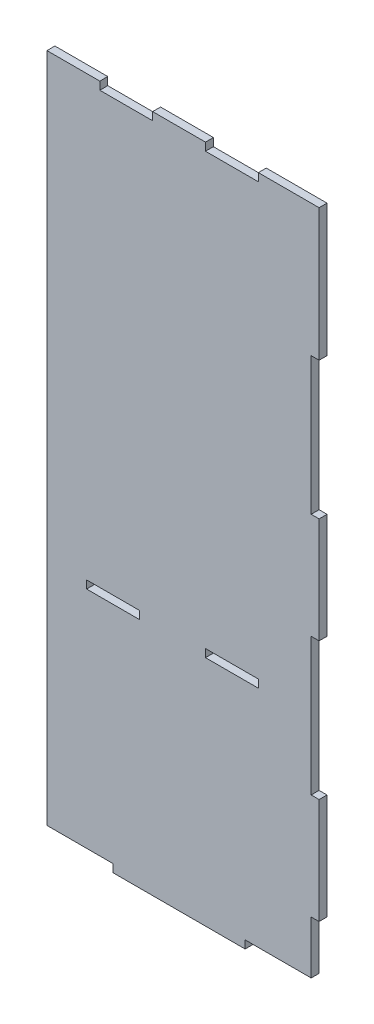
ISO-10303-21;
HEADER;
FILE_DESCRIPTION(('STEP AP214'),'2;1');
FILE_NAME('part.step','',(''),(''),'','','');
FILE_SCHEMA(('AUTOMOTIVE_DESIGN { 1 0 10303 214 1 1 1 1 }'));
ENDSEC;
DATA;
#1=APPLICATION_CONTEXT('core data for automotive mechanical design processes');
#2=APPLICATION_PROTOCOL_DEFINITION('international standard','automotive_design',2000,#1);
#3=PRODUCT_CONTEXT('',#1,'mechanical');
#4=PRODUCT('Part','Part','',(#3));
#5=PRODUCT_RELATED_PRODUCT_CATEGORY('part','',(#4));
#6=PRODUCT_DEFINITION_FORMATION('','',#4);
#7=PRODUCT_DEFINITION_CONTEXT('part definition',#1,'design');
#8=PRODUCT_DEFINITION('design','',#6,#7);
#9=PRODUCT_DEFINITION_SHAPE('','',#8);
#10=(LENGTH_UNIT() NAMED_UNIT(*) SI_UNIT(.MILLI.,.METRE.));
#11=(NAMED_UNIT(*) PLANE_ANGLE_UNIT() SI_UNIT($,.RADIAN.));
#12=(NAMED_UNIT(*) SI_UNIT($,.STERADIAN.) SOLID_ANGLE_UNIT());
#13=UNCERTAINTY_MEASURE_WITH_UNIT(LENGTH_MEASURE(1.E-05),#10,'distance_accuracy_value','');
#14=(GEOMETRIC_REPRESENTATION_CONTEXT(3) GLOBAL_UNCERTAINTY_ASSIGNED_CONTEXT((#13)) GLOBAL_UNIT_ASSIGNED_CONTEXT((#10,
#11,#12)) REPRESENTATION_CONTEXT('',''));
#15=CARTESIAN_POINT('',(0.,0.,0.));
#16=DIRECTION('',(0.,0.,1.));
#17=DIRECTION('',(1.,0.,0.));
#18=AXIS2_PLACEMENT_3D('',#15,#16,#17);
#19=CARTESIAN_POINT('',(40.7478559176672,98.6809605488851,3.));
#20=DIRECTION('',(-1.,0.,0.));
#21=DIRECTION('',(0.,-1.,0.));
#22=AXIS2_PLACEMENT_3D('',#19,#20,#21);
#23=PLANE('',#22);
#24=DIRECTION('',(0.,0.,1.));
#25=VECTOR('',#24,1.);
#26=CARTESIAN_POINT('',(40.7478559176672,-95.3190394511175,0.));
#27=LINE('',#26,#25);
#28=CARTESIAN_POINT('',(40.7478559176672,-95.3190394511175,0.));
#29=VERTEX_POINT('',#28);
#30=CARTESIAN_POINT('',(40.7478559176672,-95.3190394511175,3.));
#31=VERTEX_POINT('',#30);
#32=EDGE_CURVE('E338',#29,#31,#27,.T.);
#33=ORIENTED_EDGE('',*,*,#32,.F.);
#34=DIRECTION('',(0.,1.,0.));
#35=VECTOR('',#34,1.);
#36=CARTESIAN_POINT('',(40.7478559176672,98.6809605488851,0.));
#37=LINE('',#36,#35);
#38=CARTESIAN_POINT('',(40.7478559176672,-43.3190394511175,0.));
#39=VERTEX_POINT('',#38);
#40=EDGE_CURVE('E507',#29,#39,#37,.T.);
#41=ORIENTED_EDGE('',*,*,#40,.T.);
#42=DIRECTION('',(0.,0.,-1.));
#43=VECTOR('',#42,1.);
#44=CARTESIAN_POINT('',(40.7478559176672,-43.3190394511175,3.));
#45=LINE('',#44,#43);
#46=CARTESIAN_POINT('',(40.7478559176672,-43.3190394511175,3.));
#47=VERTEX_POINT('',#46);
#48=EDGE_CURVE('E368',#47,#39,#45,.T.);
#49=ORIENTED_EDGE('',*,*,#48,.F.);
#50=DIRECTION('',(0.,1.,0.));
#51=VECTOR('',#50,1.);
#52=CARTESIAN_POINT('',(40.7478559176672,98.6809605488851,3.));
#53=LINE('',#52,#51);
#54=EDGE_CURVE('E492',#31,#47,#53,.T.);
#55=ORIENTED_EDGE('',*,*,#54,.F.);
#56=EDGE_LOOP('',(#33,#41,#49,#55));
#57=FACE_BOUND('',#56,.T.);
#58=ADVANCED_FACE('F34',(#57),#23,.F.);
#59=CARTESIAN_POINT('',(40.7478559176672,-155.319039451115,0.));
#60=VERTEX_POINT('',#59);
#61=CARTESIAN_POINT('',(40.7478559176672,-135.319039451117,0.));
#62=VERTEX_POINT('',#61);
#63=EDGE_CURVE('E504',#60,#62,#37,.T.);
#64=ORIENTED_EDGE('',*,*,#63,.T.);
#65=DIRECTION('',(0.,0.,1.));
#66=VECTOR('',#65,1.);
#67=CARTESIAN_POINT('',(40.7478559176672,-135.319039451117,0.));
#68=LINE('',#67,#66);
#69=CARTESIAN_POINT('',(40.7478559176672,-135.319039451117,3.));
#70=VERTEX_POINT('',#69);
#71=EDGE_CURVE('E341',#62,#70,#68,.T.);
#72=ORIENTED_EDGE('',*,*,#71,.T.);
#73=CARTESIAN_POINT('',(40.7478559176672,-155.319039451115,3.));
#74=VERTEX_POINT('',#73);
#75=EDGE_CURVE('E488',#74,#70,#53,.T.);
#76=ORIENTED_EDGE('',*,*,#75,.F.);
#77=DIRECTION('',(0.,0.,-1.));
#78=VECTOR('',#77,1.);
#79=CARTESIAN_POINT('',(40.7478559176672,-155.319039451115,3.));
#80=LINE('',#79,#78);
#81=EDGE_CURVE('E42',#74,#60,#80,.T.);
#82=ORIENTED_EDGE('',*,*,#81,.T.);
#83=EDGE_LOOP('',(#64,#72,#76,#82));
#84=FACE_BOUND('',#83,.T.);
#85=ADVANCED_FACE('F517',(#84),#23,.F.);
#86=CARTESIAN_POINT('',(-59.2521440823328,98.6809605488851,3.));
#87=DIRECTION('',(0.,-1.,0.));
#88=DIRECTION('',(0.,0.,-1.));
#89=AXIS2_PLACEMENT_3D('',#86,#87,#88);
#90=PLANE('',#89);
#91=DIRECTION('',(-1.,0.,0.));
#92=VECTOR('',#91,1.);
#93=CARTESIAN_POINT('',(-59.2521440823328,98.6809605488851,0.));
#94=LINE('',#93,#92);
#95=CARTESIAN_POINT('',(0.747855917667215,98.6809605488851,0.));
#96=VERTEX_POINT('',#95);
#97=CARTESIAN_POINT('',(-19.2521440823328,98.6809605488851,0.));
#98=VERTEX_POINT('',#97);
#99=EDGE_CURVE('E510',#96,#98,#94,.T.);
#100=ORIENTED_EDGE('',*,*,#99,.T.);
#101=DIRECTION('',(0.,0.,-1.));
#102=VECTOR('',#101,1.);
#103=CARTESIAN_POINT('',(-19.2521440823328,98.6809605488851,0.));
#104=LINE('',#103,#102);
#105=CARTESIAN_POINT('',(-19.2521440823328,98.6809605488851,3.));
#106=VERTEX_POINT('',#105);
#107=EDGE_CURVE('E415',#106,#98,#104,.T.);
#108=ORIENTED_EDGE('',*,*,#107,.F.);
#109=DIRECTION('',(-1.,0.,0.));
#110=VECTOR('',#109,1.);
#111=CARTESIAN_POINT('',(-59.2521440823328,98.6809605488851,3.));
#112=LINE('',#111,#110);
#113=CARTESIAN_POINT('',(0.747855917667215,98.6809605488851,3.));
#114=VERTEX_POINT('',#113);
#115=EDGE_CURVE('E497',#114,#106,#112,.T.);
#116=ORIENTED_EDGE('',*,*,#115,.F.);
#117=DIRECTION('',(0.,0.,1.));
#118=VECTOR('',#117,1.);
#119=CARTESIAN_POINT('',(0.747855917667215,98.6809605488851,0.));
#120=LINE('',#119,#118);
#121=EDGE_CURVE('E401',#96,#114,#120,.T.);
#122=ORIENTED_EDGE('',*,*,#121,.F.);
#123=EDGE_LOOP('',(#100,#108,#116,#122));
#124=FACE_BOUND('',#123,.T.);
#125=ADVANCED_FACE('F563',(#124),#90,.F.);
#126=CARTESIAN_POINT('',(-39.2521440823328,98.6809605488851,3.));
#127=VERTEX_POINT('',#126);
#128=CARTESIAN_POINT('',(-59.2521440823328,98.6809605488851,3.));
#129=VERTEX_POINT('',#128);
#130=EDGE_CURVE('E491',#127,#129,#112,.T.);
#131=ORIENTED_EDGE('',*,*,#130,.F.);
#132=DIRECTION('',(0.,0.,1.));
#133=VECTOR('',#132,1.);
#134=CARTESIAN_POINT('',(-39.2521440823328,98.6809605488851,0.));
#135=LINE('',#134,#133);
#136=CARTESIAN_POINT('',(-39.2521440823328,98.6809605488851,0.));
#137=VERTEX_POINT('',#136);
#138=EDGE_CURVE('E405',#137,#127,#135,.T.);
#139=ORIENTED_EDGE('',*,*,#138,.F.);
#140=CARTESIAN_POINT('',(-59.2521440823328,98.6809605488851,0.));
#141=VERTEX_POINT('',#140);
#142=EDGE_CURVE('E506',#137,#141,#94,.T.);
#143=ORIENTED_EDGE('',*,*,#142,.T.);
#144=DIRECTION('',(0.,0.,-1.));
#145=VECTOR('',#144,1.);
#146=CARTESIAN_POINT('',(-59.2521440823328,98.6809605488851,3.));
#147=LINE('',#146,#145);
#148=EDGE_CURVE('E496',#129,#141,#147,.T.);
#149=ORIENTED_EDGE('',*,*,#148,.F.);
#150=EDGE_LOOP('',(#131,#139,#143,#149));
#151=FACE_BOUND('',#150,.T.);
#152=ADVANCED_FACE('F632',(#151),#90,.F.);
#153=CARTESIAN_POINT('',(-59.2521440823328,-155.319039451115,3.));
#154=DIRECTION('',(0.,1.,0.));
#155=DIRECTION('',(0.,0.,1.));
#156=AXIS2_PLACEMENT_3D('',#153,#154,#155);
#157=PLANE('',#156);
#158=DIRECTION('',(0.,0.,-1.));
#159=VECTOR('',#158,1.);
#160=CARTESIAN_POINT('',(-34.2521440823328,-155.319039451115,3.));
#161=LINE('',#160,#159);
#162=CARTESIAN_POINT('',(-34.2521440823328,-155.319039451115,3.));
#163=VERTEX_POINT('',#162);
#164=CARTESIAN_POINT('',(-34.2521440823328,-155.319039451115,0.));
#165=VERTEX_POINT('',#164);
#166=EDGE_CURVE('E421',#163,#165,#161,.T.);
#167=ORIENTED_EDGE('',*,*,#166,.F.);
#168=DIRECTION('',(1.,0.,0.));
#169=VECTOR('',#168,1.);
#170=CARTESIAN_POINT('',(-59.2521440823328,-155.319039451115,3.));
#171=LINE('',#170,#169);
#172=CARTESIAN_POINT('',(-59.2521440823328,-155.319039451115,3.));
#173=VERTEX_POINT('',#172);
#174=EDGE_CURVE('E484',#173,#163,#171,.T.);
#175=ORIENTED_EDGE('',*,*,#174,.F.);
#176=DIRECTION('',(0.,0.,-1.));
#177=VECTOR('',#176,1.);
#178=CARTESIAN_POINT('',(-59.2521440823328,-155.319039451115,3.));
#179=LINE('',#178,#177);
#180=CARTESIAN_POINT('',(-59.2521440823328,-155.319039451115,0.));
#181=VERTEX_POINT('',#180);
#182=EDGE_CURVE('E11',#173,#181,#179,.T.);
#183=ORIENTED_EDGE('',*,*,#182,.T.);
#184=DIRECTION('',(1.,0.,0.));
#185=VECTOR('',#184,1.);
#186=CARTESIAN_POINT('',(-59.2521440823328,-155.319039451115,0.));
#187=LINE('',#186,#185);
#188=EDGE_CURVE('E501',#181,#165,#187,.T.);
#189=ORIENTED_EDGE('',*,*,#188,.T.);
#190=EDGE_LOOP('',(#167,#175,#183,#189));
#191=FACE_BOUND('',#190,.T.);
#192=ADVANCED_FACE('F547',(#191),#157,.F.);
#193=DIRECTION('',(0.,0.,1.));
#194=VECTOR('',#193,1.);
#195=CARTESIAN_POINT('',(15.7478559176672,-155.319039451115,3.));
#196=LINE('',#195,#194);
#197=CARTESIAN_POINT('',(15.7478559176672,-155.319039451115,0.));
#198=VERTEX_POINT('',#197);
#199=CARTESIAN_POINT('',(15.7478559176672,-155.319039451115,3.));
#200=VERTEX_POINT('',#199);
#201=EDGE_CURVE('E456',#198,#200,#196,.T.);
#202=ORIENTED_EDGE('',*,*,#201,.F.);
#203=EDGE_CURVE('E500',#198,#60,#187,.T.);
#204=ORIENTED_EDGE('',*,*,#203,.T.);
#205=ORIENTED_EDGE('',*,*,#81,.F.);
#206=EDGE_CURVE('E482',#200,#74,#171,.T.);
#207=ORIENTED_EDGE('',*,*,#206,.F.);
#208=EDGE_LOOP('',(#202,#204,#205,#207));
#209=FACE_BOUND('',#208,.T.);
#210=ADVANCED_FACE('F535',(#209),#157,.F.);
#211=CARTESIAN_POINT('',(-59.2521440823328,98.6809605488851,3.));
#212=DIRECTION('',(1.,0.,0.));
#213=DIRECTION('',(0.,1.,0.));
#214=AXIS2_PLACEMENT_3D('',#211,#212,#213);
#215=PLANE('',#214);
#216=DIRECTION('',(0.,-1.,0.));
#217=VECTOR('',#216,1.);
#218=CARTESIAN_POINT('',(-59.2521440823328,98.6809605488851,0.));
#219=LINE('',#218,#217);
#220=EDGE_CURVE('E478',#141,#181,#219,.T.);
#221=ORIENTED_EDGE('',*,*,#220,.T.);
#222=ORIENTED_EDGE('',*,*,#182,.F.);
#223=DIRECTION('',(0.,-1.,0.));
#224=VECTOR('',#223,1.);
#225=CARTESIAN_POINT('',(-59.2521440823328,98.6809605488851,3.));
#226=LINE('',#225,#224);
#227=EDGE_CURVE('E479',#129,#173,#226,.T.);
#228=ORIENTED_EDGE('',*,*,#227,.F.);
#229=ORIENTED_EDGE('',*,*,#148,.T.);
#230=EDGE_LOOP('',(#221,#222,#228,#229));
#231=FACE_BOUND('',#230,.T.);
#232=ADVANCED_FACE('F36',(#231),#215,.F.);
#233=CARTESIAN_POINT('',(40.7478559176672,-3.31903945111747,3.));
#234=VERTEX_POINT('',#233);
#235=CARTESIAN_POINT('',(40.7478559176672,48.6809605488851,3.));
#236=VERTEX_POINT('',#235);
#237=EDGE_CURVE('E487',#234,#236,#53,.T.);
#238=ORIENTED_EDGE('',*,*,#237,.F.);
#239=DIRECTION('',(0.,0.,-1.));
#240=VECTOR('',#239,1.);
#241=CARTESIAN_POINT('',(40.7478559176672,-3.31903945111747,3.));
#242=LINE('',#241,#240);
#243=CARTESIAN_POINT('',(40.7478559176672,-3.31903945111747,0.));
#244=VERTEX_POINT('',#243);
#245=EDGE_CURVE('E365',#234,#244,#242,.T.);
#246=ORIENTED_EDGE('',*,*,#245,.T.);
#247=CARTESIAN_POINT('',(40.7478559176672,48.6809605488851,0.));
#248=VERTEX_POINT('',#247);
#249=EDGE_CURVE('E503',#244,#248,#37,.T.);
#250=ORIENTED_EDGE('',*,*,#249,.T.);
#251=DIRECTION('',(0.,0.,1.));
#252=VECTOR('',#251,1.);
#253=CARTESIAN_POINT('',(40.7478559176672,48.6809605488851,0.));
#254=LINE('',#253,#252);
#255=EDGE_CURVE('E372',#248,#236,#254,.T.);
#256=ORIENTED_EDGE('',*,*,#255,.T.);
#257=EDGE_LOOP('',(#238,#246,#250,#256));
#258=FACE_BOUND('',#257,.T.);
#259=ADVANCED_FACE('F595',(#258),#23,.F.);
#260=CARTESIAN_POINT('',(43.7478559176672,98.6809605488851,0.));
#261=VERTEX_POINT('',#260);
#262=CARTESIAN_POINT('',(20.7478559176672,98.6809605488851,0.));
#263=VERTEX_POINT('',#262);
#264=EDGE_CURVE('E483',#261,#263,#94,.T.);
#265=ORIENTED_EDGE('',*,*,#264,.T.);
#266=DIRECTION('',(0.,0.,-1.));
#267=VECTOR('',#266,1.);
#268=CARTESIAN_POINT('',(20.7478559176672,98.6809605488851,0.));
#269=LINE('',#268,#267);
#270=CARTESIAN_POINT('',(20.7478559176672,98.6809605488851,3.));
#271=VERTEX_POINT('',#270);
#272=EDGE_CURVE('E433',#271,#263,#269,.T.);
#273=ORIENTED_EDGE('',*,*,#272,.F.);
#274=CARTESIAN_POINT('',(43.7478559176672,98.6809605488851,3.));
#275=VERTEX_POINT('',#274);
#276=EDGE_CURVE('E493',#275,#271,#112,.T.);
#277=ORIENTED_EDGE('',*,*,#276,.F.);
#278=DIRECTION('',(0.,0.,1.));
#279=VECTOR('',#278,1.);
#280=CARTESIAN_POINT('',(43.7478559176672,98.6809605488851,0.));
#281=LINE('',#280,#279);
#282=EDGE_CURVE('E382',#261,#275,#281,.T.);
#283=ORIENTED_EDGE('',*,*,#282,.F.);
#284=EDGE_LOOP('',(#265,#273,#277,#283));
#285=FACE_BOUND('',#284,.T.);
#286=ADVANCED_FACE('F583',(#285),#90,.F.);
#287=CARTESIAN_POINT('',(0.,0.,3.));
#288=DIRECTION('',(0.,0.,1.));
#289=DIRECTION('',(1.,0.,0.));
#290=AXIS2_PLACEMENT_3D('',#287,#288,#289);
#291=PLANE('',#290);
#292=DIRECTION('',(0.,-1.,0.));
#293=VECTOR('',#292,1.);
#294=CARTESIAN_POINT('',(20.7478559176646,-67.3190394511058,3.));
#295=LINE('',#294,#293);
#296=CARTESIAN_POINT('',(20.7478559176646,-67.3190394511058,3.));
#297=VERTEX_POINT('',#296);
#298=CARTESIAN_POINT('',(20.7478559176646,-70.3190394511058,3.));
#299=VERTEX_POINT('',#298);
#300=EDGE_CURVE('E259',#297,#299,#295,.T.);
#301=ORIENTED_EDGE('',*,*,#300,.T.);
#302=DIRECTION('',(-1.,0.,0.));
#303=VECTOR('',#302,1.);
#304=CARTESIAN_POINT('',(20.7478559176646,-70.3190394511058,3.));
#305=LINE('',#304,#303);
#306=CARTESIAN_POINT('',(0.747855917664561,-70.3190394511058,3.));
#307=VERTEX_POINT('',#306);
#308=EDGE_CURVE('E270',#299,#307,#305,.T.);
#309=ORIENTED_EDGE('',*,*,#308,.T.);
#310=DIRECTION('',(0.,1.,0.));
#311=VECTOR('',#310,1.);
#312=CARTESIAN_POINT('',(0.747855917664561,-67.3190394511058,3.));
#313=LINE('',#312,#311);
#314=CARTESIAN_POINT('',(0.747855917664561,-67.3190394511058,3.));
#315=VERTEX_POINT('',#314);
#316=EDGE_CURVE('E49',#307,#315,#313,.T.);
#317=ORIENTED_EDGE('',*,*,#316,.T.);
#318=DIRECTION('',(1.,0.,0.));
#319=VECTOR('',#318,1.);
#320=CARTESIAN_POINT('',(20.7478559176646,-67.3190394511058,3.));
#321=LINE('',#320,#319);
#322=EDGE_CURVE('E267',#315,#297,#321,.T.);
#323=ORIENTED_EDGE('',*,*,#322,.T.);
#324=EDGE_LOOP('',(#301,#309,#317,#323));
#325=FACE_BOUND('',#324,.T.);
#326=DIRECTION('',(0.,-1.,0.));
#327=VECTOR('',#326,1.);
#328=CARTESIAN_POINT('',(-24.2521440823354,-67.3190394511058,3.));
#329=LINE('',#328,#327);
#330=CARTESIAN_POINT('',(-24.2521440823354,-67.3190394511058,3.));
#331=VERTEX_POINT('',#330);
#332=CARTESIAN_POINT('',(-24.2521440823354,-70.3190394511058,3.));
#333=VERTEX_POINT('',#332);
#334=EDGE_CURVE('E297',#331,#333,#329,.T.);
#335=ORIENTED_EDGE('',*,*,#334,.T.);
#336=DIRECTION('',(-1.,0.,0.));
#337=VECTOR('',#336,1.);
#338=CARTESIAN_POINT('',(-24.2521440823354,-70.3190394511058,3.));
#339=LINE('',#338,#337);
#340=CARTESIAN_POINT('',(-44.2521440823354,-70.3190394511058,3.));
#341=VERTEX_POINT('',#340);
#342=EDGE_CURVE('E300',#333,#341,#339,.T.);
#343=ORIENTED_EDGE('',*,*,#342,.T.);
#344=DIRECTION('',(0.,1.,0.));
#345=VECTOR('',#344,1.);
#346=CARTESIAN_POINT('',(-44.2521440823354,-67.3190394511058,3.));
#347=LINE('',#346,#345);
#348=CARTESIAN_POINT('',(-44.2521440823354,-67.3190394511058,3.));
#349=VERTEX_POINT('',#348);
#350=EDGE_CURVE('E57',#341,#349,#347,.T.);
#351=ORIENTED_EDGE('',*,*,#350,.T.);
#352=DIRECTION('',(1.,0.,0.));
#353=VECTOR('',#352,1.);
#354=CARTESIAN_POINT('',(-24.2521440823354,-67.3190394511058,3.));
#355=LINE('',#354,#353);
#356=EDGE_CURVE('E305',#349,#331,#355,.T.);
#357=ORIENTED_EDGE('',*,*,#356,.T.);
#358=EDGE_LOOP('',(#335,#343,#351,#357));
#359=FACE_BOUND('',#358,.T.);
#360=DIRECTION('',(0.,1.,0.));
#361=VECTOR('',#360,1.);
#362=CARTESIAN_POINT('',(-19.2521440823328,95.6809605488851,3.));
#363=LINE('',#362,#361);
#364=CARTESIAN_POINT('',(-19.2521440823328,95.6809605488851,3.));
#365=VERTEX_POINT('',#364);
#366=EDGE_CURVE('E419',#365,#106,#363,.T.);
#367=ORIENTED_EDGE('',*,*,#366,.F.);
#368=DIRECTION('',(1.,0.,0.));
#369=VECTOR('',#368,1.);
#370=CARTESIAN_POINT('',(-19.2521440823328,95.6809605488851,3.));
#371=LINE('',#370,#369);
#372=CARTESIAN_POINT('',(-39.2521440823328,95.6809605488851,3.));
#373=VERTEX_POINT('',#372);
#374=EDGE_CURVE('E411',#373,#365,#371,.T.);
#375=ORIENTED_EDGE('',*,*,#374,.F.);
#376=DIRECTION('',(0.,1.,0.));
#377=VECTOR('',#376,1.);
#378=CARTESIAN_POINT('',(-39.2521440823328,95.6809605488851,3.));
#379=LINE('',#378,#377);
#380=EDGE_CURVE('E422',#373,#127,#379,.T.);
#381=ORIENTED_EDGE('',*,*,#380,.T.);
#382=ORIENTED_EDGE('',*,*,#130,.T.);
#383=ORIENTED_EDGE('',*,*,#227,.T.);
#384=ORIENTED_EDGE('',*,*,#174,.T.);
#385=DIRECTION('',(0.,1.,0.));
#386=VECTOR('',#385,1.);
#387=CARTESIAN_POINT('',(-34.2521440823328,-158.319039451115,3.));
#388=LINE('',#387,#386);
#389=CARTESIAN_POINT('',(-34.2521440823328,-158.319039451115,3.));
#390=VERTEX_POINT('',#389);
#391=EDGE_CURVE('E462',#390,#163,#388,.T.);
#392=ORIENTED_EDGE('',*,*,#391,.F.);
#393=DIRECTION('',(-1.,0.,0.));
#394=VECTOR('',#393,1.);
#395=CARTESIAN_POINT('',(-34.2521440823328,-158.319039451115,3.));
#396=LINE('',#395,#394);
#397=CARTESIAN_POINT('',(15.7478559176672,-158.319039451115,3.));
#398=VERTEX_POINT('',#397);
#399=EDGE_CURVE('E460',#398,#390,#396,.T.);
#400=ORIENTED_EDGE('',*,*,#399,.F.);
#401=DIRECTION('',(0.,1.,0.));
#402=VECTOR('',#401,1.);
#403=CARTESIAN_POINT('',(15.7478559176672,-158.319039451115,3.));
#404=LINE('',#403,#402);
#405=EDGE_CURVE('E469',#398,#200,#404,.T.);
#406=ORIENTED_EDGE('',*,*,#405,.T.);
#407=ORIENTED_EDGE('',*,*,#206,.T.);
#408=ORIENTED_EDGE('',*,*,#75,.T.);
#409=DIRECTION('',(-1.,0.,0.));
#410=VECTOR('',#409,1.);
#411=CARTESIAN_POINT('',(43.7478559176672,-135.319039451117,3.));
#412=LINE('',#411,#410);
#413=CARTESIAN_POINT('',(43.7478559176672,-135.319039451117,3.));
#414=VERTEX_POINT('',#413);
#415=EDGE_CURVE('E326',#414,#70,#412,.T.);
#416=ORIENTED_EDGE('',*,*,#415,.F.);
#417=DIRECTION('',(0.,1.,0.));
#418=VECTOR('',#417,1.);
#419=CARTESIAN_POINT('',(43.7478559176672,-135.319039451117,3.));
#420=LINE('',#419,#418);
#421=CARTESIAN_POINT('',(43.7478559176672,-95.3190394511175,3.));
#422=VERTEX_POINT('',#421);
#423=EDGE_CURVE('E348',#414,#422,#420,.T.);
#424=ORIENTED_EDGE('',*,*,#423,.T.);
#425=DIRECTION('',(-1.,0.,0.));
#426=VECTOR('',#425,1.);
#427=CARTESIAN_POINT('',(43.7478559176672,-95.3190394511175,3.));
#428=LINE('',#427,#426);
#429=EDGE_CURVE('E330',#422,#31,#428,.T.);
#430=ORIENTED_EDGE('',*,*,#429,.T.);
#431=ORIENTED_EDGE('',*,*,#54,.T.);
#432=DIRECTION('',(-1.,0.,0.));
#433=VECTOR('',#432,1.);
#434=CARTESIAN_POINT('',(43.7478559176672,-43.3190394511175,3.));
#435=LINE('',#434,#433);
#436=CARTESIAN_POINT('',(43.7478559176672,-43.3190394511175,3.));
#437=VERTEX_POINT('',#436);
#438=EDGE_CURVE('E361',#437,#47,#435,.T.);
#439=ORIENTED_EDGE('',*,*,#438,.F.);
#440=DIRECTION('',(0.,1.,0.));
#441=VECTOR('',#440,1.);
#442=CARTESIAN_POINT('',(43.7478559176672,-43.3190394511175,3.));
#443=LINE('',#442,#441);
#444=CARTESIAN_POINT('',(43.7478559176672,-3.31903945111747,3.));
#445=VERTEX_POINT('',#444);
#446=EDGE_CURVE('E364',#437,#445,#443,.T.);
#447=ORIENTED_EDGE('',*,*,#446,.T.);
#448=DIRECTION('',(-1.,0.,0.));
#449=VECTOR('',#448,1.);
#450=CARTESIAN_POINT('',(43.7478559176672,-3.31903945111747,3.));
#451=LINE('',#450,#449);
#452=EDGE_CURVE('E358',#445,#234,#451,.T.);
#453=ORIENTED_EDGE('',*,*,#452,.T.);
#454=ORIENTED_EDGE('',*,*,#237,.T.);
#455=DIRECTION('',(-1.,0.,0.));
#456=VECTOR('',#455,1.);
#457=CARTESIAN_POINT('',(43.7478559176672,48.6809605488851,3.));
#458=LINE('',#457,#456);
#459=CARTESIAN_POINT('',(43.7478559176672,48.6809605488851,3.));
#460=VERTEX_POINT('',#459);
#461=EDGE_CURVE('E398',#460,#236,#458,.T.);
#462=ORIENTED_EDGE('',*,*,#461,.F.);
#463=DIRECTION('',(0.,-1.,0.));
#464=VECTOR('',#463,1.);
#465=CARTESIAN_POINT('',(43.7478559176672,98.6809605488851,3.));
#466=LINE('',#465,#464);
#467=EDGE_CURVE('E385',#275,#460,#466,.T.);
#468=ORIENTED_EDGE('',*,*,#467,.F.);
#469=ORIENTED_EDGE('',*,*,#276,.T.);
#470=DIRECTION('',(0.,1.,0.));
#471=VECTOR('',#470,1.);
#472=CARTESIAN_POINT('',(20.7478559176672,95.6809605488851,3.));
#473=LINE('',#472,#471);
#474=CARTESIAN_POINT('',(20.7478559176672,95.6809605488851,3.));
#475=VERTEX_POINT('',#474);
#476=EDGE_CURVE('E448',#475,#271,#473,.T.);
#477=ORIENTED_EDGE('',*,*,#476,.F.);
#478=DIRECTION('',(1.,0.,0.));
#479=VECTOR('',#478,1.);
#480=CARTESIAN_POINT('',(0.747855917667216,95.6809605488851,3.));
#481=LINE('',#480,#479);
#482=CARTESIAN_POINT('',(0.747855917667216,95.6809605488851,3.));
#483=VERTEX_POINT('',#482);
#484=EDGE_CURVE('E432',#483,#475,#481,.T.);
#485=ORIENTED_EDGE('',*,*,#484,.F.);
#486=DIRECTION('',(0.,1.,0.));
#487=VECTOR('',#486,1.);
#488=CARTESIAN_POINT('',(0.747855917667216,95.6809605488851,3.));
#489=LINE('',#488,#487);
#490=EDGE_CURVE('E441',#483,#114,#489,.T.);
#491=ORIENTED_EDGE('',*,*,#490,.T.);
#492=ORIENTED_EDGE('',*,*,#115,.T.);
#493=EDGE_LOOP('',(#367,#375,#381,#382,#383,#384,#392,#400,#406,#407,#408,#416,#424,#430,#431,
#439,#447,#453,#454,#462,#468,#469,#477,#485,#491,#492));
#494=FACE_BOUND('',#493,.T.);
#495=ADVANCED_FACE('F274',(#325,#359,#494),#291,.T.);
#496=CARTESIAN_POINT('',(0.,0.,0.));
#497=DIRECTION('',(0.,0.,1.));
#498=DIRECTION('',(1.,0.,0.));
#499=AXIS2_PLACEMENT_3D('',#496,#497,#498);
#500=PLANE('',#499);
#501=DIRECTION('',(-1.,0.,0.));
#502=VECTOR('',#501,1.);
#503=CARTESIAN_POINT('',(20.7478559176646,-70.3190394511058,0.));
#504=LINE('',#503,#502);
#505=CARTESIAN_POINT('',(20.7478559176646,-70.3190394511058,0.));
#506=VERTEX_POINT('',#505);
#507=CARTESIAN_POINT('',(0.747855917664561,-70.3190394511058,0.));
#508=VERTEX_POINT('',#507);
#509=EDGE_CURVE('E286',#506,#508,#504,.T.);
#510=ORIENTED_EDGE('',*,*,#509,.F.);
#511=DIRECTION('',(0.,-1.,0.));
#512=VECTOR('',#511,1.);
#513=CARTESIAN_POINT('',(20.7478559176646,-67.3190394511058,0.));
#514=LINE('',#513,#512);
#515=CARTESIAN_POINT('',(20.7478559176646,-67.3190394511058,0.));
#516=VERTEX_POINT('',#515);
#517=EDGE_CURVE('E262',#516,#506,#514,.T.);
#518=ORIENTED_EDGE('',*,*,#517,.F.);
#519=DIRECTION('',(1.,0.,0.));
#520=VECTOR('',#519,1.);
#521=CARTESIAN_POINT('',(20.7478559176646,-67.3190394511058,0.));
#522=LINE('',#521,#520);
#523=CARTESIAN_POINT('',(0.747855917664561,-67.3190394511058,0.));
#524=VERTEX_POINT('',#523);
#525=EDGE_CURVE('E277',#524,#516,#522,.T.);
#526=ORIENTED_EDGE('',*,*,#525,.F.);
#527=DIRECTION('',(0.,1.,0.));
#528=VECTOR('',#527,1.);
#529=CARTESIAN_POINT('',(0.747855917664561,-67.3190394511058,0.));
#530=LINE('',#529,#528);
#531=EDGE_CURVE('E280',#508,#524,#530,.T.);
#532=ORIENTED_EDGE('',*,*,#531,.F.);
#533=EDGE_LOOP('',(#510,#518,#526,#532));
#534=FACE_BOUND('',#533,.T.);
#535=DIRECTION('',(-1.,0.,0.));
#536=VECTOR('',#535,1.);
#537=CARTESIAN_POINT('',(-24.2521440823354,-70.3190394511058,0.));
#538=LINE('',#537,#536);
#539=CARTESIAN_POINT('',(-24.2521440823354,-70.3190394511058,0.));
#540=VERTEX_POINT('',#539);
#541=CARTESIAN_POINT('',(-44.2521440823354,-70.3190394511058,0.));
#542=VERTEX_POINT('',#541);
#543=EDGE_CURVE('E311',#540,#542,#538,.T.);
#544=ORIENTED_EDGE('',*,*,#543,.F.);
#545=DIRECTION('',(0.,-1.,0.));
#546=VECTOR('',#545,1.);
#547=CARTESIAN_POINT('',(-24.2521440823354,-67.3190394511058,0.));
#548=LINE('',#547,#546);
#549=CARTESIAN_POINT('',(-24.2521440823354,-67.3190394511058,0.));
#550=VERTEX_POINT('',#549);
#551=EDGE_CURVE('E309',#550,#540,#548,.T.);
#552=ORIENTED_EDGE('',*,*,#551,.F.);
#553=DIRECTION('',(1.,0.,0.));
#554=VECTOR('',#553,1.);
#555=CARTESIAN_POINT('',(-24.2521440823354,-67.3190394511058,0.));
#556=LINE('',#555,#554);
#557=CARTESIAN_POINT('',(-44.2521440823354,-67.3190394511058,0.));
#558=VERTEX_POINT('',#557);
#559=EDGE_CURVE('E301',#558,#550,#556,.T.);
#560=ORIENTED_EDGE('',*,*,#559,.F.);
#561=DIRECTION('',(0.,1.,0.));
#562=VECTOR('',#561,1.);
#563=CARTESIAN_POINT('',(-44.2521440823354,-67.3190394511058,0.));
#564=LINE('',#563,#562);
#565=EDGE_CURVE('E314',#542,#558,#564,.T.);
#566=ORIENTED_EDGE('',*,*,#565,.F.);
#567=EDGE_LOOP('',(#544,#552,#560,#566));
#568=FACE_BOUND('',#567,.T.);
#569=DIRECTION('',(-1.,0.,0.));
#570=VECTOR('',#569,1.);
#571=CARTESIAN_POINT('',(-19.2521440823328,95.6809605488851,0.));
#572=LINE('',#571,#570);
#573=CARTESIAN_POINT('',(-19.2521440823328,95.6809605488851,0.));
#574=VERTEX_POINT('',#573);
#575=CARTESIAN_POINT('',(-39.2521440823328,95.6809605488851,0.));
#576=VERTEX_POINT('',#575);
#577=EDGE_CURVE('E404',#574,#576,#572,.T.);
#578=ORIENTED_EDGE('',*,*,#577,.F.);
#579=DIRECTION('',(0.,1.,0.));
#580=VECTOR('',#579,1.);
#581=CARTESIAN_POINT('',(-19.2521440823328,95.6809605488851,0.));
#582=LINE('',#581,#580);
#583=EDGE_CURVE('E414',#574,#98,#582,.T.);
#584=ORIENTED_EDGE('',*,*,#583,.T.);
#585=ORIENTED_EDGE('',*,*,#99,.F.);
#586=DIRECTION('',(0.,1.,0.));
#587=VECTOR('',#586,1.);
#588=CARTESIAN_POINT('',(0.747855917667216,95.6809605488851,0.));
#589=LINE('',#588,#587);
#590=CARTESIAN_POINT('',(0.747855917667216,95.6809605488851,0.));
#591=VERTEX_POINT('',#590);
#592=EDGE_CURVE('E417',#591,#96,#589,.T.);
#593=ORIENTED_EDGE('',*,*,#592,.F.);
#594=DIRECTION('',(-1.,0.,0.));
#595=VECTOR('',#594,1.);
#596=CARTESIAN_POINT('',(0.747855917667216,95.6809605488851,0.));
#597=LINE('',#596,#595);
#598=CARTESIAN_POINT('',(20.7478559176672,95.6809605488851,0.));
#599=VERTEX_POINT('',#598);
#600=EDGE_CURVE('E438',#599,#591,#597,.T.);
#601=ORIENTED_EDGE('',*,*,#600,.F.);
#602=DIRECTION('',(0.,1.,0.));
#603=VECTOR('',#602,1.);
#604=CARTESIAN_POINT('',(20.7478559176672,95.6809605488851,0.));
#605=LINE('',#604,#603);
#606=EDGE_CURVE('E445',#599,#263,#605,.T.);
#607=ORIENTED_EDGE('',*,*,#606,.T.);
#608=ORIENTED_EDGE('',*,*,#264,.F.);
#609=DIRECTION('',(0.,-1.,0.));
#610=VECTOR('',#609,1.);
#611=CARTESIAN_POINT('',(43.7478559176672,98.6809605488851,0.));
#612=LINE('',#611,#610);
#613=CARTESIAN_POINT('',(43.7478559176672,48.6809605488851,0.));
#614=VERTEX_POINT('',#613);
#615=EDGE_CURVE('E390',#261,#614,#612,.T.);
#616=ORIENTED_EDGE('',*,*,#615,.T.);
#617=DIRECTION('',(-1.,0.,0.));
#618=VECTOR('',#617,1.);
#619=CARTESIAN_POINT('',(43.7478559176672,48.6809605488851,0.));
#620=LINE('',#619,#618);
#621=EDGE_CURVE('E393',#614,#248,#620,.T.);
#622=ORIENTED_EDGE('',*,*,#621,.T.);
#623=ORIENTED_EDGE('',*,*,#249,.F.);
#624=DIRECTION('',(-1.,0.,0.));
#625=VECTOR('',#624,1.);
#626=CARTESIAN_POINT('',(43.7478559176672,-3.31903945111747,0.));
#627=LINE('',#626,#625);
#628=CARTESIAN_POINT('',(43.7478559176672,-3.31903945111747,0.));
#629=VERTEX_POINT('',#628);
#630=EDGE_CURVE('E355',#629,#244,#627,.T.);
#631=ORIENTED_EDGE('',*,*,#630,.F.);
#632=DIRECTION('',(0.,1.,0.));
#633=VECTOR('',#632,1.);
#634=CARTESIAN_POINT('',(43.7478559176672,-43.3190394511175,0.));
#635=LINE('',#634,#633);
#636=CARTESIAN_POINT('',(43.7478559176672,-43.3190394511175,0.));
#637=VERTEX_POINT('',#636);
#638=EDGE_CURVE('E378',#637,#629,#635,.T.);
#639=ORIENTED_EDGE('',*,*,#638,.F.);
#640=DIRECTION('',(-1.,0.,0.));
#641=VECTOR('',#640,1.);
#642=CARTESIAN_POINT('',(43.7478559176672,-43.3190394511175,0.));
#643=LINE('',#642,#641);
#644=EDGE_CURVE('E344',#637,#39,#643,.T.);
#645=ORIENTED_EDGE('',*,*,#644,.T.);
#646=ORIENTED_EDGE('',*,*,#40,.F.);
#647=DIRECTION('',(-1.,0.,0.));
#648=VECTOR('',#647,1.);
#649=CARTESIAN_POINT('',(43.7478559176672,-95.3190394511175,0.));
#650=LINE('',#649,#648);
#651=CARTESIAN_POINT('',(43.7478559176672,-95.3190394511175,0.));
#652=VERTEX_POINT('',#651);
#653=EDGE_CURVE('E333',#652,#29,#650,.T.);
#654=ORIENTED_EDGE('',*,*,#653,.F.);
#655=DIRECTION('',(0.,1.,0.));
#656=VECTOR('',#655,1.);
#657=CARTESIAN_POINT('',(43.7478559176672,-135.319039451117,0.));
#658=LINE('',#657,#656);
#659=CARTESIAN_POINT('',(43.7478559176672,-135.319039451117,0.));
#660=VERTEX_POINT('',#659);
#661=EDGE_CURVE('E329',#660,#652,#658,.T.);
#662=ORIENTED_EDGE('',*,*,#661,.F.);
#663=DIRECTION('',(-1.,0.,0.));
#664=VECTOR('',#663,1.);
#665=CARTESIAN_POINT('',(43.7478559176672,-135.319039451117,0.));
#666=LINE('',#665,#664);
#667=EDGE_CURVE('E293',#660,#62,#666,.T.);
#668=ORIENTED_EDGE('',*,*,#667,.T.);
#669=ORIENTED_EDGE('',*,*,#63,.F.);
#670=ORIENTED_EDGE('',*,*,#203,.F.);
#671=DIRECTION('',(0.,1.,0.));
#672=VECTOR('',#671,1.);
#673=CARTESIAN_POINT('',(15.7478559176672,-158.319039451115,0.));
#674=LINE('',#673,#672);
#675=CARTESIAN_POINT('',(15.7478559176672,-158.319039451115,0.));
#676=VERTEX_POINT('',#675);
#677=EDGE_CURVE('E472',#676,#198,#674,.T.);
#678=ORIENTED_EDGE('',*,*,#677,.F.);
#679=DIRECTION('',(1.,0.,0.));
#680=VECTOR('',#679,1.);
#681=CARTESIAN_POINT('',(-34.2521440823328,-158.319039451115,0.));
#682=LINE('',#681,#680);
#683=CARTESIAN_POINT('',(-34.2521440823328,-158.319039451115,0.));
#684=VERTEX_POINT('',#683);
#685=EDGE_CURVE('E455',#684,#676,#682,.T.);
#686=ORIENTED_EDGE('',*,*,#685,.F.);
#687=DIRECTION('',(0.,1.,0.));
#688=VECTOR('',#687,1.);
#689=CARTESIAN_POINT('',(-34.2521440823328,-158.319039451115,0.));
#690=LINE('',#689,#688);
#691=EDGE_CURVE('E475',#684,#165,#690,.T.);
#692=ORIENTED_EDGE('',*,*,#691,.T.);
#693=ORIENTED_EDGE('',*,*,#188,.F.);
#694=ORIENTED_EDGE('',*,*,#220,.F.);
#695=ORIENTED_EDGE('',*,*,#142,.F.);
#696=DIRECTION('',(0.,1.,0.));
#697=VECTOR('',#696,1.);
#698=CARTESIAN_POINT('',(-39.2521440823328,95.6809605488851,0.));
#699=LINE('',#698,#697);
#700=EDGE_CURVE('E425',#576,#137,#699,.T.);
#701=ORIENTED_EDGE('',*,*,#700,.F.);
#702=EDGE_LOOP('',(#578,#584,#585,#593,#601,#607,#608,#616,#622,#623,#631,#639,#645,#646,#654,
#662,#668,#669,#670,#678,#686,#692,#693,#694,#695,#701));
#703=FACE_BOUND('',#702,.T.);
#704=ADVANCED_FACE('F522',(#534,#568,#703),#500,.F.);
#705=CARTESIAN_POINT('',(-34.2521440823328,-158.319039451115,3.));
#706=DIRECTION('',(1.,0.,0.));
#707=DIRECTION('',(0.,0.,-1.));
#708=AXIS2_PLACEMENT_3D('',#705,#706,#707);
#709=PLANE('',#708);
#710=ORIENTED_EDGE('',*,*,#166,.T.);
#711=ORIENTED_EDGE('',*,*,#691,.F.);
#712=DIRECTION('',(0.,0.,-1.));
#713=VECTOR('',#712,1.);
#714=CARTESIAN_POINT('',(-34.2521440823328,-158.319039451115,3.));
#715=LINE('',#714,#713);
#716=EDGE_CURVE('E452',#390,#684,#715,.T.);
#717=ORIENTED_EDGE('',*,*,#716,.F.);
#718=ORIENTED_EDGE('',*,*,#391,.T.);
#719=EDGE_LOOP('',(#710,#711,#717,#718));
#720=FACE_BOUND('',#719,.T.);
#721=ADVANCED_FACE('F545',(#720),#709,.F.);
#722=CARTESIAN_POINT('',(15.7478559176672,-158.319039451115,3.));
#723=DIRECTION('',(-1.,0.,0.));
#724=DIRECTION('',(0.,0.,1.));
#725=AXIS2_PLACEMENT_3D('',#722,#723,#724);
#726=PLANE('',#725);
#727=ORIENTED_EDGE('',*,*,#201,.T.);
#728=ORIENTED_EDGE('',*,*,#405,.F.);
#729=DIRECTION('',(0.,0.,1.));
#730=VECTOR('',#729,1.);
#731=CARTESIAN_POINT('',(15.7478559176672,-158.319039451115,3.));
#732=LINE('',#731,#730);
#733=EDGE_CURVE('E458',#676,#398,#732,.T.);
#734=ORIENTED_EDGE('',*,*,#733,.F.);
#735=ORIENTED_EDGE('',*,*,#677,.T.);
#736=EDGE_LOOP('',(#727,#728,#734,#735));
#737=FACE_BOUND('',#736,.T.);
#738=ADVANCED_FACE('F537',(#737),#726,.F.);
#739=CARTESIAN_POINT('',(0.,-158.319039451115,0.));
#740=DIRECTION('',(0.,-1.,0.));
#741=DIRECTION('',(0.,0.,-1.));
#742=AXIS2_PLACEMENT_3D('',#739,#740,#741);
#743=PLANE('',#742);
#744=ORIENTED_EDGE('',*,*,#716,.T.);
#745=ORIENTED_EDGE('',*,*,#685,.T.);
#746=ORIENTED_EDGE('',*,*,#733,.T.);
#747=ORIENTED_EDGE('',*,*,#399,.T.);
#748=EDGE_LOOP('',(#744,#745,#746,#747));
#749=FACE_BOUND('',#748,.T.);
#750=ADVANCED_FACE('F542',(#749),#743,.T.);
#751=CARTESIAN_POINT('',(0.747855917667216,95.6809605488851,0.));
#752=DIRECTION('',(-1.,0.,0.));
#753=DIRECTION('',(0.,-1.,0.));
#754=AXIS2_PLACEMENT_3D('',#751,#752,#753);
#755=PLANE('',#754);
#756=ORIENTED_EDGE('',*,*,#121,.T.);
#757=ORIENTED_EDGE('',*,*,#490,.F.);
#758=DIRECTION('',(0.,0.,1.));
#759=VECTOR('',#758,1.);
#760=CARTESIAN_POINT('',(0.747855917667216,95.6809605488851,0.));
#761=LINE('',#760,#759);
#762=EDGE_CURVE('E429',#591,#483,#761,.T.);
#763=ORIENTED_EDGE('',*,*,#762,.F.);
#764=ORIENTED_EDGE('',*,*,#592,.T.);
#765=EDGE_LOOP('',(#756,#757,#763,#764));
#766=FACE_BOUND('',#765,.T.);
#767=ADVANCED_FACE('F575',(#766),#755,.F.);
#768=CARTESIAN_POINT('',(20.7478559176672,95.6809605488851,0.));
#769=DIRECTION('',(1.,0.,0.));
#770=DIRECTION('',(0.,1.,0.));
#771=AXIS2_PLACEMENT_3D('',#768,#769,#770);
#772=PLANE('',#771);
#773=ORIENTED_EDGE('',*,*,#272,.T.);
#774=ORIENTED_EDGE('',*,*,#606,.F.);
#775=DIRECTION('',(0.,0.,-1.));
#776=VECTOR('',#775,1.);
#777=CARTESIAN_POINT('',(20.7478559176672,95.6809605488851,0.));
#778=LINE('',#777,#776);
#779=EDGE_CURVE('E436',#475,#599,#778,.T.);
#780=ORIENTED_EDGE('',*,*,#779,.F.);
#781=ORIENTED_EDGE('',*,*,#476,.T.);
#782=EDGE_LOOP('',(#773,#774,#780,#781));
#783=FACE_BOUND('',#782,.T.);
#784=ADVANCED_FACE('F659',(#783),#772,.F.);
#785=CARTESIAN_POINT('',(0.,95.6809605488851,0.));
#786=DIRECTION('',(0.,1.,0.));
#787=DIRECTION('',(0.,0.,1.));
#788=AXIS2_PLACEMENT_3D('',#785,#786,#787);
#789=PLANE('',#788);
#790=ORIENTED_EDGE('',*,*,#762,.T.);
#791=ORIENTED_EDGE('',*,*,#484,.T.);
#792=ORIENTED_EDGE('',*,*,#779,.T.);
#793=ORIENTED_EDGE('',*,*,#600,.T.);
#794=EDGE_LOOP('',(#790,#791,#792,#793));
#795=FACE_BOUND('',#794,.T.);
#796=ADVANCED_FACE('F577',(#795),#789,.T.);
#797=CARTESIAN_POINT('',(-19.2521440823328,95.6809605488851,0.));
#798=DIRECTION('',(1.,0.,0.));
#799=DIRECTION('',(0.,1.,0.));
#800=AXIS2_PLACEMENT_3D('',#797,#798,#799);
#801=PLANE('',#800);
#802=ORIENTED_EDGE('',*,*,#107,.T.);
#803=ORIENTED_EDGE('',*,*,#583,.F.);
#804=DIRECTION('',(0.,0.,-1.));
#805=VECTOR('',#804,1.);
#806=CARTESIAN_POINT('',(-19.2521440823328,95.6809605488851,0.));
#807=LINE('',#806,#805);
#808=EDGE_CURVE('E402',#365,#574,#807,.T.);
#809=ORIENTED_EDGE('',*,*,#808,.F.);
#810=ORIENTED_EDGE('',*,*,#366,.T.);
#811=EDGE_LOOP('',(#802,#803,#809,#810));
#812=FACE_BOUND('',#811,.T.);
#813=ADVANCED_FACE('F570',(#812),#801,.F.);
#814=CARTESIAN_POINT('',(-39.2521440823328,95.6809605488851,0.));
#815=DIRECTION('',(-1.,0.,0.));
#816=DIRECTION('',(0.,0.,1.));
#817=AXIS2_PLACEMENT_3D('',#814,#815,#816);
#818=PLANE('',#817);
#819=ORIENTED_EDGE('',*,*,#138,.T.);
#820=ORIENTED_EDGE('',*,*,#380,.F.);
#821=DIRECTION('',(0.,0.,1.));
#822=VECTOR('',#821,1.);
#823=CARTESIAN_POINT('',(-39.2521440823328,95.6809605488851,0.));
#824=LINE('',#823,#822);
#825=EDGE_CURVE('E408',#576,#373,#824,.T.);
#826=ORIENTED_EDGE('',*,*,#825,.F.);
#827=ORIENTED_EDGE('',*,*,#700,.T.);
#828=EDGE_LOOP('',(#819,#820,#826,#827));
#829=FACE_BOUND('',#828,.T.);
#830=ADVANCED_FACE('F666',(#829),#818,.F.);
#831=CARTESIAN_POINT('',(0.,95.6809605488851,0.));
#832=DIRECTION('',(0.,-1.,0.));
#833=DIRECTION('',(1.,0.,0.));
#834=AXIS2_PLACEMENT_3D('',#831,#832,#833);
#835=PLANE('',#834);
#836=ORIENTED_EDGE('',*,*,#808,.T.);
#837=ORIENTED_EDGE('',*,*,#577,.T.);
#838=ORIENTED_EDGE('',*,*,#825,.T.);
#839=ORIENTED_EDGE('',*,*,#374,.T.);
#840=EDGE_LOOP('',(#836,#837,#838,#839));
#841=FACE_BOUND('',#840,.T.);
#842=ADVANCED_FACE('F669',(#841),#835,.F.);
#843=CARTESIAN_POINT('',(43.7478559176672,48.6809605488851,0.));
#844=DIRECTION('',(0.,-1.,0.));
#845=DIRECTION('',(0.,0.,-1.));
#846=AXIS2_PLACEMENT_3D('',#843,#844,#845);
#847=PLANE('',#846);
#848=ORIENTED_EDGE('',*,*,#255,.F.);
#849=ORIENTED_EDGE('',*,*,#621,.F.);
#850=DIRECTION('',(0.,0.,1.));
#851=VECTOR('',#850,1.);
#852=CARTESIAN_POINT('',(43.7478559176672,48.6809605488851,0.));
#853=LINE('',#852,#851);
#854=EDGE_CURVE('E387',#614,#460,#853,.T.);
#855=ORIENTED_EDGE('',*,*,#854,.T.);
#856=ORIENTED_EDGE('',*,*,#461,.T.);
#857=EDGE_LOOP('',(#848,#849,#855,#856));
#858=FACE_BOUND('',#857,.T.);
#859=ADVANCED_FACE('F592',(#858),#847,.T.);
#860=CARTESIAN_POINT('',(43.7478559176672,0.,0.));
#861=DIRECTION('',(1.,0.,0.));
#862=DIRECTION('',(0.,1.,0.));
#863=AXIS2_PLACEMENT_3D('',#860,#861,#862);
#864=PLANE('',#863);
#865=ORIENTED_EDGE('',*,*,#282,.T.);
#866=ORIENTED_EDGE('',*,*,#467,.T.);
#867=ORIENTED_EDGE('',*,*,#854,.F.);
#868=ORIENTED_EDGE('',*,*,#615,.F.);
#869=EDGE_LOOP('',(#865,#866,#867,#868));
#870=FACE_BOUND('',#869,.T.);
#871=ADVANCED_FACE('F588',(#870),#864,.T.);
#872=CARTESIAN_POINT('',(43.7478559176672,-43.3190394511175,3.));
#873=DIRECTION('',(0.,1.,0.));
#874=DIRECTION('',(0.,0.,1.));
#875=AXIS2_PLACEMENT_3D('',#872,#873,#874);
#876=PLANE('',#875);
#877=ORIENTED_EDGE('',*,*,#48,.T.);
#878=ORIENTED_EDGE('',*,*,#644,.F.);
#879=DIRECTION('',(0.,0.,-1.));
#880=VECTOR('',#879,1.);
#881=CARTESIAN_POINT('',(43.7478559176672,-43.3190394511175,3.));
#882=LINE('',#881,#880);
#883=EDGE_CURVE('E369',#437,#637,#882,.T.);
#884=ORIENTED_EDGE('',*,*,#883,.F.);
#885=ORIENTED_EDGE('',*,*,#438,.T.);
#886=EDGE_LOOP('',(#877,#878,#884,#885));
#887=FACE_BOUND('',#886,.T.);
#888=ADVANCED_FACE('F603',(#887),#876,.F.);
#889=CARTESIAN_POINT('',(43.7478559176672,-3.31903945111747,3.));
#890=DIRECTION('',(0.,1.,0.));
#891=DIRECTION('',(-1.,0.,0.));
#892=AXIS2_PLACEMENT_3D('',#889,#890,#891);
#893=PLANE('',#892);
#894=ORIENTED_EDGE('',*,*,#245,.F.);
#895=ORIENTED_EDGE('',*,*,#452,.F.);
#896=DIRECTION('',(0.,0.,-1.));
#897=VECTOR('',#896,1.);
#898=CARTESIAN_POINT('',(43.7478559176672,-3.31903945111747,3.));
#899=LINE('',#898,#897);
#900=EDGE_CURVE('E375',#445,#629,#899,.T.);
#901=ORIENTED_EDGE('',*,*,#900,.T.);
#902=ORIENTED_EDGE('',*,*,#630,.T.);
#903=EDGE_LOOP('',(#894,#895,#901,#902));
#904=FACE_BOUND('',#903,.T.);
#905=ADVANCED_FACE('F608',(#904),#893,.T.);
#906=CARTESIAN_POINT('',(43.7478559176672,0.,0.));
#907=DIRECTION('',(1.,0.,0.));
#908=DIRECTION('',(0.,1.,0.));
#909=AXIS2_PLACEMENT_3D('',#906,#907,#908);
#910=PLANE('',#909);
#911=ORIENTED_EDGE('',*,*,#883,.T.);
#912=ORIENTED_EDGE('',*,*,#638,.T.);
#913=ORIENTED_EDGE('',*,*,#900,.F.);
#914=ORIENTED_EDGE('',*,*,#446,.F.);
#915=EDGE_LOOP('',(#911,#912,#913,#914));
#916=FACE_BOUND('',#915,.T.);
#917=ADVANCED_FACE('F610',(#916),#910,.T.);
#918=CARTESIAN_POINT('',(43.7478559176672,-135.319039451117,0.));
#919=DIRECTION('',(0.,-1.,0.));
#920=DIRECTION('',(1.,0.,0.));
#921=AXIS2_PLACEMENT_3D('',#918,#919,#920);
#922=PLANE('',#921);
#923=ORIENTED_EDGE('',*,*,#71,.F.);
#924=ORIENTED_EDGE('',*,*,#667,.F.);
#925=DIRECTION('',(0.,0.,1.));
#926=VECTOR('',#925,1.);
#927=CARTESIAN_POINT('',(43.7478559176672,-135.319039451117,0.));
#928=LINE('',#927,#926);
#929=EDGE_CURVE('E342',#660,#414,#928,.T.);
#930=ORIENTED_EDGE('',*,*,#929,.T.);
#931=ORIENTED_EDGE('',*,*,#415,.T.);
#932=EDGE_LOOP('',(#923,#924,#930,#931));
#933=FACE_BOUND('',#932,.T.);
#934=ADVANCED_FACE('F529',(#933),#922,.T.);
#935=CARTESIAN_POINT('',(43.7478559176672,-95.3190394511175,0.));
#936=DIRECTION('',(0.,-1.,0.));
#937=DIRECTION('',(1.,0.,0.));
#938=AXIS2_PLACEMENT_3D('',#935,#936,#937);
#939=PLANE('',#938);
#940=ORIENTED_EDGE('',*,*,#32,.T.);
#941=ORIENTED_EDGE('',*,*,#429,.F.);
#942=DIRECTION('',(0.,0.,1.));
#943=VECTOR('',#942,1.);
#944=CARTESIAN_POINT('',(43.7478559176672,-95.3190394511175,0.));
#945=LINE('',#944,#943);
#946=EDGE_CURVE('E346',#652,#422,#945,.T.);
#947=ORIENTED_EDGE('',*,*,#946,.F.);
#948=ORIENTED_EDGE('',*,*,#653,.T.);
#949=EDGE_LOOP('',(#940,#941,#947,#948));
#950=FACE_BOUND('',#949,.T.);
#951=ADVANCED_FACE('F617',(#950),#939,.F.);
#952=CARTESIAN_POINT('',(43.7478559176672,0.,0.));
#953=DIRECTION('',(-1.,0.,0.));
#954=DIRECTION('',(0.,-1.,0.));
#955=AXIS2_PLACEMENT_3D('',#952,#953,#954);
#956=PLANE('',#955);
#957=ORIENTED_EDGE('',*,*,#929,.F.);
#958=ORIENTED_EDGE('',*,*,#661,.T.);
#959=ORIENTED_EDGE('',*,*,#946,.T.);
#960=ORIENTED_EDGE('',*,*,#423,.F.);
#961=EDGE_LOOP('',(#957,#958,#959,#960));
#962=FACE_BOUND('',#961,.T.);
#963=ADVANCED_FACE('F683',(#962),#956,.F.);
#964=CARTESIAN_POINT('',(-24.2521440823354,-67.3190394511058,3.));
#965=DIRECTION('',(1.,0.,0.));
#966=DIRECTION('',(0.,0.,-1.));
#967=AXIS2_PLACEMENT_3D('',#964,#965,#966);
#968=PLANE('',#967);
#969=ORIENTED_EDGE('',*,*,#551,.T.);
#970=DIRECTION('',(0.,0.,-1.));
#971=VECTOR('',#970,1.);
#972=CARTESIAN_POINT('',(-24.2521440823354,-70.3190394511058,3.));
#973=LINE('',#972,#971);
#974=EDGE_CURVE('E308',#333,#540,#973,.T.);
#975=ORIENTED_EDGE('',*,*,#974,.F.);
#976=ORIENTED_EDGE('',*,*,#334,.F.);
#977=DIRECTION('',(0.,0.,-1.));
#978=VECTOR('',#977,1.);
#979=CARTESIAN_POINT('',(-24.2521440823354,-67.3190394511058,3.));
#980=LINE('',#979,#978);
#981=EDGE_CURVE('E287',#331,#550,#980,.T.);
#982=ORIENTED_EDGE('',*,*,#981,.T.);
#983=EDGE_LOOP('',(#969,#975,#976,#982));
#984=FACE_BOUND('',#983,.T.);
#985=ADVANCED_FACE('F686',(#984),#968,.F.);
#986=CARTESIAN_POINT('',(-24.2521440823354,-67.3190394511058,3.));
#987=DIRECTION('',(0.,1.,0.));
#988=DIRECTION('',(0.,0.,1.));
#989=AXIS2_PLACEMENT_3D('',#986,#987,#988);
#990=PLANE('',#989);
#991=ORIENTED_EDGE('',*,*,#559,.T.);
#992=ORIENTED_EDGE('',*,*,#981,.F.);
#993=ORIENTED_EDGE('',*,*,#356,.F.);
#994=DIRECTION('',(0.,0.,-1.));
#995=VECTOR('',#994,1.);
#996=CARTESIAN_POINT('',(-44.2521440823354,-67.3190394511058,3.));
#997=LINE('',#996,#995);
#998=EDGE_CURVE('E320',#349,#558,#997,.T.);
#999=ORIENTED_EDGE('',*,*,#998,.T.);
#1000=EDGE_LOOP('',(#991,#992,#993,#999));
#1001=FACE_BOUND('',#1000,.T.);
#1002=ADVANCED_FACE('F693',(#1001),#990,.F.);
#1003=CARTESIAN_POINT('',(-44.2521440823354,-67.3190394511058,3.));
#1004=DIRECTION('',(-1.,0.,0.));
#1005=DIRECTION('',(0.,0.,1.));
#1006=AXIS2_PLACEMENT_3D('',#1003,#1004,#1005);
#1007=PLANE('',#1006);
#1008=ORIENTED_EDGE('',*,*,#565,.T.);
#1009=ORIENTED_EDGE('',*,*,#998,.F.);
#1010=ORIENTED_EDGE('',*,*,#350,.F.);
#1011=DIRECTION('',(0.,0.,-1.));
#1012=VECTOR('',#1011,1.);
#1013=CARTESIAN_POINT('',(-44.2521440823354,-70.3190394511058,3.));
#1014=LINE('',#1013,#1012);
#1015=EDGE_CURVE('E322',#341,#542,#1014,.T.);
#1016=ORIENTED_EDGE('',*,*,#1015,.T.);
#1017=EDGE_LOOP('',(#1008,#1009,#1010,#1016));
#1018=FACE_BOUND('',#1017,.T.);
#1019=ADVANCED_FACE('F698',(#1018),#1007,.F.);
#1020=CARTESIAN_POINT('',(-24.2521440823354,-70.3190394511058,3.));
#1021=DIRECTION('',(0.,-1.,0.));
#1022=DIRECTION('',(0.,0.,-1.));
#1023=AXIS2_PLACEMENT_3D('',#1020,#1021,#1022);
#1024=PLANE('',#1023);
#1025=ORIENTED_EDGE('',*,*,#543,.T.);
#1026=ORIENTED_EDGE('',*,*,#1015,.F.);
#1027=ORIENTED_EDGE('',*,*,#342,.F.);
#1028=ORIENTED_EDGE('',*,*,#974,.T.);
#1029=EDGE_LOOP('',(#1025,#1026,#1027,#1028));
#1030=FACE_BOUND('',#1029,.T.);
#1031=ADVANCED_FACE('F695',(#1030),#1024,.F.);
#1032=CARTESIAN_POINT('',(20.7478559176646,-67.3190394511058,3.));
#1033=DIRECTION('',(1.,0.,0.));
#1034=DIRECTION('',(0.,0.,-1.));
#1035=AXIS2_PLACEMENT_3D('',#1032,#1033,#1034);
#1036=PLANE('',#1035);
#1037=ORIENTED_EDGE('',*,*,#517,.T.);
#1038=DIRECTION('',(0.,0.,-1.));
#1039=VECTOR('',#1038,1.);
#1040=CARTESIAN_POINT('',(20.7478559176646,-70.3190394511058,3.));
#1041=LINE('',#1040,#1039);
#1042=EDGE_CURVE('E255',#299,#506,#1041,.T.);
#1043=ORIENTED_EDGE('',*,*,#1042,.F.);
#1044=ORIENTED_EDGE('',*,*,#300,.F.);
#1045=DIRECTION('',(0.,0.,-1.));
#1046=VECTOR('',#1045,1.);
#1047=CARTESIAN_POINT('',(20.7478559176646,-67.3190394511058,3.));
#1048=LINE('',#1047,#1046);
#1049=EDGE_CURVE('E291',#297,#516,#1048,.T.);
#1050=ORIENTED_EDGE('',*,*,#1049,.T.);
#1051=EDGE_LOOP('',(#1037,#1043,#1044,#1050));
#1052=FACE_BOUND('',#1051,.T.);
#1053=ADVANCED_FACE('F257',(#1052),#1036,.F.);
#1054=CARTESIAN_POINT('',(20.7478559176646,-67.3190394511058,3.));
#1055=DIRECTION('',(0.,1.,0.));
#1056=DIRECTION('',(0.,0.,1.));
#1057=AXIS2_PLACEMENT_3D('',#1054,#1055,#1056);
#1058=PLANE('',#1057);
#1059=ORIENTED_EDGE('',*,*,#525,.T.);
#1060=ORIENTED_EDGE('',*,*,#1049,.F.);
#1061=ORIENTED_EDGE('',*,*,#322,.F.);
#1062=DIRECTION('',(0.,0.,-1.));
#1063=VECTOR('',#1062,1.);
#1064=CARTESIAN_POINT('',(0.747855917664561,-67.3190394511058,3.));
#1065=LINE('',#1064,#1063);
#1066=EDGE_CURVE('E294',#315,#524,#1065,.T.);
#1067=ORIENTED_EDGE('',*,*,#1066,.T.);
#1068=EDGE_LOOP('',(#1059,#1060,#1061,#1067));
#1069=FACE_BOUND('',#1068,.T.);
#1070=ADVANCED_FACE('F707',(#1069),#1058,.F.);
#1071=CARTESIAN_POINT('',(0.747855917664561,-67.3190394511058,3.));
#1072=DIRECTION('',(-1.,0.,0.));
#1073=DIRECTION('',(0.,0.,1.));
#1074=AXIS2_PLACEMENT_3D('',#1071,#1072,#1073);
#1075=PLANE('',#1074);
#1076=ORIENTED_EDGE('',*,*,#531,.T.);
#1077=ORIENTED_EDGE('',*,*,#1066,.F.);
#1078=ORIENTED_EDGE('',*,*,#316,.F.);
#1079=DIRECTION('',(0.,0.,-1.));
#1080=VECTOR('',#1079,1.);
#1081=CARTESIAN_POINT('',(0.747855917664561,-70.3190394511058,3.));
#1082=LINE('',#1081,#1080);
#1083=EDGE_CURVE('E266',#307,#508,#1082,.T.);
#1084=ORIENTED_EDGE('',*,*,#1083,.T.);
#1085=EDGE_LOOP('',(#1076,#1077,#1078,#1084));
#1086=FACE_BOUND('',#1085,.T.);
#1087=ADVANCED_FACE('F710',(#1086),#1075,.F.);
#1088=CARTESIAN_POINT('',(20.7478559176646,-70.3190394511058,3.));
#1089=DIRECTION('',(0.,-1.,0.));
#1090=DIRECTION('',(0.,0.,-1.));
#1091=AXIS2_PLACEMENT_3D('',#1088,#1089,#1090);
#1092=PLANE('',#1091);
#1093=ORIENTED_EDGE('',*,*,#509,.T.);
#1094=ORIENTED_EDGE('',*,*,#1083,.F.);
#1095=ORIENTED_EDGE('',*,*,#308,.F.);
#1096=ORIENTED_EDGE('',*,*,#1042,.T.);
#1097=EDGE_LOOP('',(#1093,#1094,#1095,#1096));
#1098=FACE_BOUND('',#1097,.T.);
#1099=ADVANCED_FACE('F271',(#1098),#1092,.F.);
#1100=CLOSED_SHELL('',(#58,#85,#125,#152,#192,#210,#232,#259,#286,#495,#704,#721,#738,#750,#767,
#784,#796,#813,#830,#842,#859,#871,#888,#905,#917,#934,#951,#963,#985,#1002,#1019,#1031,#1053,
#1070,#1087,#1099));
#1101=MANIFOLD_SOLID_BREP('B2',#1100);
#1102=ADVANCED_BREP_SHAPE_REPRESENTATION('',(#18,#1101),#14);
#1103=SHAPE_DEFINITION_REPRESENTATION(#9,#1102);
ENDSEC;
END-ISO-10303-21;
